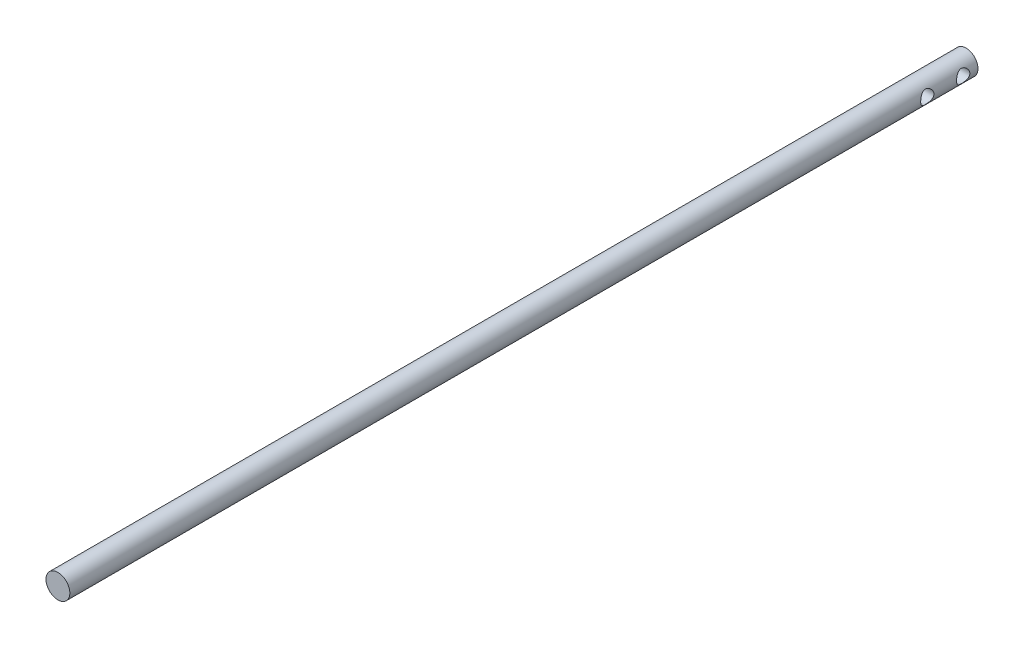
ISO-10303-21;
HEADER;
FILE_DESCRIPTION(('STEP AP214'),'2;1');
FILE_NAME('part.step','',(''),(''),'','','');
FILE_SCHEMA(('AUTOMOTIVE_DESIGN { 1 0 10303 214 1 1 1 1 }'));
ENDSEC;
DATA;
#1=APPLICATION_CONTEXT('core data for automotive mechanical design processes');
#2=APPLICATION_PROTOCOL_DEFINITION('international standard','automotive_design',2000,#1);
#3=PRODUCT_CONTEXT('',#1,'mechanical');
#4=PRODUCT('Part','Part','',(#3));
#5=PRODUCT_RELATED_PRODUCT_CATEGORY('part','',(#4));
#6=PRODUCT_DEFINITION_FORMATION('','',#4);
#7=PRODUCT_DEFINITION_CONTEXT('part definition',#1,'design');
#8=PRODUCT_DEFINITION('design','',#6,#7);
#9=PRODUCT_DEFINITION_SHAPE('','',#8);
#10=(LENGTH_UNIT() NAMED_UNIT(*) SI_UNIT(.MILLI.,.METRE.));
#11=(NAMED_UNIT(*) PLANE_ANGLE_UNIT() SI_UNIT($,.RADIAN.));
#12=(NAMED_UNIT(*) SI_UNIT($,.STERADIAN.) SOLID_ANGLE_UNIT());
#13=UNCERTAINTY_MEASURE_WITH_UNIT(LENGTH_MEASURE(1.E-05),#10,'distance_accuracy_value','');
#14=(GEOMETRIC_REPRESENTATION_CONTEXT(3) GLOBAL_UNCERTAINTY_ASSIGNED_CONTEXT((#13)) GLOBAL_UNIT_ASSIGNED_CONTEXT((#10,
#11,#12)) REPRESENTATION_CONTEXT('',''));
#15=CARTESIAN_POINT('',(0.,0.,0.));
#16=DIRECTION('',(0.,0.,1.));
#17=DIRECTION('',(1.,0.,0.));
#18=AXIS2_PLACEMENT_3D('',#15,#16,#17);
#19=CARTESIAN_POINT('',(0.,0.,290.195));
#20=DIRECTION('',(0.,0.,-1.));
#21=DIRECTION('',(-1.,0.,0.));
#22=AXIS2_PLACEMENT_3D('',#19,#20,#21);
#23=CYLINDRICAL_SURFACE('',#22,3.81);
#24=CARTESIAN_POINT('',(-3.81,0.,6.84315183541359));
#25=CARTESIAN_POINT('',(-3.81000272396915,-0.109903120525368,6.84315500711249));
#26=CARTESIAN_POINT('',(-3.80520404882976,-0.219787942676973,6.83455841836838));
#27=CARTESIAN_POINT('',(-3.78651227067397,-0.436141418658434,6.80064304515037));
#28=CARTESIAN_POINT('',(-3.77261750997984,-0.542609446098237,6.77532121264745));
#29=CARTESIAN_POINT('',(-3.73715283517132,-0.748804273393741,6.70928766939708));
#30=CARTESIAN_POINT('',(-3.71561113855085,-0.848554274168189,6.66863250524741));
#31=CARTESIAN_POINT('',(-3.66674285047561,-1.03963257780774,6.57346806610561));
#32=CARTESIAN_POINT('',(-3.63941486765178,-1.13095884750804,6.51895545832224));
#33=CARTESIAN_POINT('',(-3.57914017104166,-1.30971798893372,6.39336898888395));
#34=CARTESIAN_POINT('',(-3.54593481697913,-1.39643786779143,6.32140674076104));
#35=CARTESIAN_POINT('',(-3.47831320922967,-1.55726145934615,6.16491472285928));
#36=CARTESIAN_POINT('',(-3.44389576026551,-1.63135227256024,6.08037226658719));
#37=CARTESIAN_POINT('',(-3.37364781242873,-1.77240394345993,5.89093911618472));
#38=CARTESIAN_POINT('',(-3.33802821920248,-1.83787879099761,5.78485419480275));
#39=CARTESIAN_POINT('',(-3.27393835112561,-1.94977193066849,5.56112630399932));
#40=CARTESIAN_POINT('',(-3.24545785557034,-1.99621752725982,5.44350019738205));
#41=CARTESIAN_POINT('',(-3.20512079050007,-2.06019863168794,5.22540350678885));
#42=CARTESIAN_POINT('',(-3.1910277368409,-2.08175993194983,5.1265276311545));
#43=CARTESIAN_POINT('',(-3.17208005900489,-2.11052573938803,4.92587638964892));
#44=CARTESIAN_POINT('',(-3.16721631696437,-2.11774441632653,4.82410398635276));
#45=CARTESIAN_POINT('',(-3.16742160305382,-2.11743709347913,4.62048415379751));
#46=CARTESIAN_POINT('',(-3.17250154615915,-2.10989489098596,4.51863676490089));
#47=CARTESIAN_POINT('',(-3.19187418811177,-2.080465654009,4.31792072610913));
#48=CARTESIAN_POINT('',(-3.20617288258727,-2.05856928380448,4.21905405862976));
#49=CARTESIAN_POINT('',(-3.24212105571317,-2.00146831216549,4.02670015829644));
#50=CARTESIAN_POINT('',(-3.26377174327498,-1.96626152194867,3.93321381310434));
#51=CARTESIAN_POINT('',(-3.31208480372718,-1.883739864604,3.75316697359591));
#52=CARTESIAN_POINT('',(-3.33874913247099,-1.83642026958142,3.66660920101127));
#53=CARTESIAN_POINT('',(-3.39899906711665,-1.72268486776781,3.48890391131114));
#54=CARTESIAN_POINT('',(-3.43302054381118,-1.65445926989256,3.39906060995409));
#55=CARTESIAN_POINT('',(-3.50126729124268,-1.50466279846556,3.23128485222354));
#56=CARTESIAN_POINT('',(-3.53549270224972,-1.42308138008866,3.15336190213271));
#57=CARTESIAN_POINT('',(-3.60441371214196,-1.23891483013794,3.00371358012584));
#58=CARTESIAN_POINT('',(-3.63880402550585,-1.13503801247993,2.93342144034924));
#59=CARTESIAN_POINT('',(-3.70030112136082,-0.914824345445167,2.81163722020098));
#60=CARTESIAN_POINT('',(-3.72741269287397,-0.798495759494378,2.76013277049353));
#61=CARTESIAN_POINT('',(-3.7695667060163,-0.565240370458132,2.68135702261876));
#62=CARTESIAN_POINT('',(-3.7853284842378,-0.448940576421957,2.6526266617576));
#63=CARTESIAN_POINT('',(-3.80593181154398,-0.212245630811981,2.61523361721488));
#64=CARTESIAN_POINT('',(-3.81078302180238,-0.0918541983183382,2.60655317938896));
#65=CARTESIAN_POINT('',(-3.80910728244967,0.134855465159482,2.60957441427176));
#66=CARTESIAN_POINT('',(-3.80380890697931,0.241220546506519,2.61907517252856));
#67=CARTESIAN_POINT('',(-3.7847239414742,0.450566421095569,2.65373658120623));
#68=CARTESIAN_POINT('',(-3.77093707741477,0.553547104969691,2.67889773717503));
#69=CARTESIAN_POINT('',(-3.73619799187843,0.753098633615499,2.74363626536289));
#70=CARTESIAN_POINT('',(-3.71527289123877,0.849692111217417,2.78315910867672));
#71=CARTESIAN_POINT('',(-3.66797809494558,1.03498422239975,2.87522811409257));
#72=CARTESIAN_POINT('',(-3.64160694490076,1.12368073798806,2.92777775581076));
#73=CARTESIAN_POINT('',(-3.58251022434211,1.30049216482004,3.05054472705072));
#74=CARTESIAN_POINT('',(-3.54940980724022,1.38760387316841,3.12202516866303));
#75=CARTESIAN_POINT('',(-3.4818910696091,1.54926657528057,3.27760100930728));
#76=CARTESIAN_POINT('',(-3.44747133108784,1.62380356131398,3.36171028185668));
#77=CARTESIAN_POINT('',(-3.37711445462438,1.76581080273581,3.55022424808963));
#78=CARTESIAN_POINT('',(-3.34137455695297,1.83180948334845,3.65582040335671));
#79=CARTESIAN_POINT('',(-3.27687424809242,1.94485341864586,3.87862709172973));
#80=CARTESIAN_POINT('',(-3.24810399517817,1.99192546208335,3.99582091443648));
#81=CARTESIAN_POINT('',(-3.20705719012402,2.05719447009945,4.21347081896027));
#82=CARTESIAN_POINT('',(-3.19259239985026,2.07936557979403,4.3123219752088));
#83=CARTESIAN_POINT('',(-3.17287377744901,2.10933831479679,4.51304379988107));
#84=CARTESIAN_POINT('',(-3.16761072560228,2.11715432365359,4.61491134180289));
#85=CARTESIAN_POINT('',(-3.1670475757208,2.11799670148983,4.81886086876427));
#86=CARTESIAN_POINT('',(-3.17175998818663,2.11100449908454,4.92094296249137));
#87=CARTESIAN_POINT('',(-3.19048127256239,2.08259611667813,5.12222055351287));
#88=CARTESIAN_POINT('',(-3.20449608149149,2.06117072492888,5.22141416507513));
#89=CARTESIAN_POINT('',(-3.23992016074254,2.00501906411773,5.41414615320846));
#90=CARTESIAN_POINT('',(-3.26130554751647,1.97033571687885,5.50770166293879));
#91=CARTESIAN_POINT('',(-3.30916017332902,1.88885852724219,5.68795690476995));
#92=CARTESIAN_POINT('',(-3.33563136858112,1.84206002243654,5.77465398065784));
#93=CARTESIAN_POINT('',(-3.39551449934804,1.72951563045821,5.95261563242561));
#94=CARTESIAN_POINT('',(-3.42937116826468,1.66197689943889,6.04259830370375));
#95=CARTESIAN_POINT('',(-3.49740415879534,1.51358345926981,6.21077175209854));
#96=CARTESIAN_POINT('',(-3.53158071751542,1.43271798849977,6.28895290067345));
#97=CARTESIAN_POINT('',(-3.60063145229145,1.24982573931889,6.4394954710855));
#98=CARTESIAN_POINT('',(-3.63520587096543,1.1464710451529,6.51039689314144));
#99=CARTESIAN_POINT('',(-3.69720244630307,0.927218497318849,6.63349923940364));
#100=CARTESIAN_POINT('',(-3.72462976617008,0.811329784594425,6.68571367369368));
#101=CARTESIAN_POINT('',(-3.76710209126095,0.580960502009219,6.76521115670946));
#102=CARTESIAN_POINT('',(-3.78303047163929,0.467268983213558,6.79429659152459));
#103=CARTESIAN_POINT('',(-3.80447385748752,0.235709049864897,6.8332576519851));
#104=CARTESIAN_POINT('',(-3.80999707921453,0.117844005860025,6.84314843454833));
#105=CARTESIAN_POINT('',(-3.81,0.,6.84315183541359));
#106=B_SPLINE_CURVE_WITH_KNOTS('',3,(#24,#25,#26,#27,#28,#29,#30,#31,#32,#33,#34,#35,#36,#37,
#38,#39,#40,#41,#42,#43,#44,#45,#46,#47,#48,#49,#50,#51,#52,#53,#54,#55,#56,#57,#58,#59,#60,#61,
#62,#63,#64,#65,#66,#67,#68,#69,#70,#71,#72,#73,#74,#75,#76,#77,#78,#79,#80,#81,#82,#83,#84,#85,
#86,#87,#88,#89,#90,#91,#92,#93,#94,#95,#96,#97,#98,#99,#100,#101,#102,#103,#104,#105),
.UNSPECIFIED.,.T.,.F.,(4,2,2,2,2,2,2,2,2,2,2,2,2,2,2,2,2,2,2,2,2,2,2,2,2,2,2,2,2,2,2,2,2,2,2,2,
2,2,2,2,4),(0.,0.329252353923495,0.658564727763082,0.986674346194904,1.31486295157328,
1.66588584058149,2.01726514770462,2.40429388180584,2.79076531941145,3.09595736564765,
3.40084774787264,3.70607298957702,4.01149694210103,4.3169711407877,4.62256475508293,
4.97463709044433,5.32698875016404,5.71512644433624,6.10300813536005,6.46339278710151,
6.82345819681447,7.14266853264614,7.46188917373932,7.77991023995402,8.0980163451661,
8.44892643956651,8.8002248887667,9.18696450104882,9.57315477887972,9.87882359793871,
10.1841859749885,10.489931542155,10.7958724315636,11.1008311314803,11.4059073668881,
11.7569768910705,12.1083313129693,12.4963718301194,12.8841312371766,13.2374523378485,
13.5904943273726),.UNSPECIFIED.);
#107=CARTESIAN_POINT('',(-3.81,0.,6.84315183541359));
#108=VERTEX_POINT('',#107);
#109=EDGE_CURVE('E37',#108,#108,#106,.T.);
#110=ORIENTED_EDGE('',*,*,#109,.T.);
#111=EDGE_LOOP('',(#110));
#112=FACE_BOUND('',#111,.T.);
#113=CARTESIAN_POINT('',(3.81,0.,2.60796529517492));
#114=CARTESIAN_POINT('',(3.81000272396915,-0.109903120525365,2.60796212347602));
#115=CARTESIAN_POINT('',(3.80520404882976,-0.219787942676968,2.61655871222017));
#116=CARTESIAN_POINT('',(3.78651227067397,-0.43614141865843,2.65047408543822));
#117=CARTESIAN_POINT('',(3.77261750997984,-0.542609446098237,2.67579591794113));
#118=CARTESIAN_POINT('',(3.73715283517132,-0.748804273393745,2.7418294611915));
#119=CARTESIAN_POINT('',(3.71561113855085,-0.848554274168194,2.78248462534117));
#120=CARTESIAN_POINT('',(3.66674285047561,-1.03963257780775,2.87764906448297));
#121=CARTESIAN_POINT('',(3.63941486765178,-1.13095884750804,2.93216167226634));
#122=CARTESIAN_POINT('',(3.57914017104166,-1.30971798893372,3.05774814170463));
#123=CARTESIAN_POINT('',(3.54593481697913,-1.39643786779143,3.12971038982754));
#124=CARTESIAN_POINT('',(3.47831320922967,-1.55726145934615,3.2862024077293));
#125=CARTESIAN_POINT('',(3.4438957602655,-1.63135227256025,3.37074486400139));
#126=CARTESIAN_POINT('',(3.37364781242873,-1.77240394345993,3.56017801440386));
#127=CARTESIAN_POINT('',(3.33802821920248,-1.83787879099762,3.66626293578584));
#128=CARTESIAN_POINT('',(3.27393835112561,-1.94977193066849,3.88999082658926));
#129=CARTESIAN_POINT('',(3.24545785557034,-1.99621752725982,4.00761693320653));
#130=CARTESIAN_POINT('',(3.20512079050007,-2.06019863168794,4.22571362379974));
#131=CARTESIAN_POINT('',(3.1910277368409,-2.08175993194983,4.32458949943409));
#132=CARTESIAN_POINT('',(3.17208005900489,-2.11052573938803,4.52524074093966));
#133=CARTESIAN_POINT('',(3.16721631696437,-2.11774441632653,4.62701314423583));
#134=CARTESIAN_POINT('',(3.16742160305382,-2.11743709347913,4.83063297679108));
#135=CARTESIAN_POINT('',(3.17250154615915,-2.10989489098596,4.93248036568769));
#136=CARTESIAN_POINT('',(3.19187418811177,-2.080465654009,5.13319640447945));
#137=CARTESIAN_POINT('',(3.20617288258727,-2.05856928380448,5.23206307195882));
#138=CARTESIAN_POINT('',(3.24212105571317,-2.00146831216549,5.42441697229214));
#139=CARTESIAN_POINT('',(3.26377174327498,-1.96626152194867,5.51790331748424));
#140=CARTESIAN_POINT('',(3.31208480372718,-1.883739864604,5.69795015699267));
#141=CARTESIAN_POINT('',(3.33874913247099,-1.83642026958141,5.7845079295773));
#142=CARTESIAN_POINT('',(3.39899906711665,-1.72268486776781,5.96221321927744));
#143=CARTESIAN_POINT('',(3.43302054381117,-1.65445926989256,6.05205652063449));
#144=CARTESIAN_POINT('',(3.50126729124268,-1.50466279846556,6.21983227836503));
#145=CARTESIAN_POINT('',(3.53549270224972,-1.42308138008866,6.29775522845586));
#146=CARTESIAN_POINT('',(3.60441371214196,-1.23891483013794,6.44740355046273));
#147=CARTESIAN_POINT('',(3.63880402550585,-1.13503801247993,6.51769569023934));
#148=CARTESIAN_POINT('',(3.70030112136082,-0.914824345445169,6.6394799103876));
#149=CARTESIAN_POINT('',(3.72741269287397,-0.798495759494379,6.69098436009504));
#150=CARTESIAN_POINT('',(3.7695667060163,-0.565240370458133,6.76976010796981));
#151=CARTESIAN_POINT('',(3.7853284842378,-0.448940576421958,6.79849046883097));
#152=CARTESIAN_POINT('',(3.80593181154398,-0.212245630811981,6.8358835133737));
#153=CARTESIAN_POINT('',(3.81078302180238,-0.0918541983183383,6.84456395119962));
#154=CARTESIAN_POINT('',(3.80910728244967,0.134855465159482,6.84154271631682));
#155=CARTESIAN_POINT('',(3.80380890697931,0.24122054650652,6.83204195806002));
#156=CARTESIAN_POINT('',(3.7847239414742,0.45056642109557,6.79738054938234));
#157=CARTESIAN_POINT('',(3.77093707741477,0.553547104969692,6.77221939341354));
#158=CARTESIAN_POINT('',(3.73619799187843,0.7530986336155,6.70748086522568));
#159=CARTESIAN_POINT('',(3.71527289123877,0.849692111217418,6.66795802191186));
#160=CARTESIAN_POINT('',(3.66797809494558,1.03498422239975,6.575889016496));
#161=CARTESIAN_POINT('',(3.64160694490076,1.12368073798806,6.52333937477781));
#162=CARTESIAN_POINT('',(3.58251022434211,1.30049216482004,6.40057240353785));
#163=CARTESIAN_POINT('',(3.54940980724022,1.38760387316842,6.32909196192554));
#164=CARTESIAN_POINT('',(3.4818910696091,1.54926657528057,6.17351612128129));
#165=CARTESIAN_POINT('',(3.44747133108784,1.62380356131398,6.08940684873189));
#166=CARTESIAN_POINT('',(3.37711445462438,1.76581080273581,5.90089288249894));
#167=CARTESIAN_POINT('',(3.34137455695297,1.83180948334846,5.79529672723186));
#168=CARTESIAN_POINT('',(3.27687424809242,1.94485341864586,5.57249003885884));
#169=CARTESIAN_POINT('',(3.24810399517817,1.99192546208335,5.45529621615209));
#170=CARTESIAN_POINT('',(3.20705719012402,2.05719447009945,5.2376463116283));
#171=CARTESIAN_POINT('',(3.19259239985026,2.07936557979404,5.13879515537977));
#172=CARTESIAN_POINT('',(3.17287377744901,2.10933831479679,4.93807333070751));
#173=CARTESIAN_POINT('',(3.16761072560228,2.11715432365359,4.83620578878569));
#174=CARTESIAN_POINT('',(3.1670475757208,2.11799670148983,4.63225626182431));
#175=CARTESIAN_POINT('',(3.17175998818663,2.11100449908454,4.53017416809721));
#176=CARTESIAN_POINT('',(3.19048127256239,2.08259611667813,4.32889657707571));
#177=CARTESIAN_POINT('',(3.20449608149149,2.06117072492888,4.22970296551345));
#178=CARTESIAN_POINT('',(3.23992016074254,2.00501906411773,4.03697097738012));
#179=CARTESIAN_POINT('',(3.26130554751647,1.97033571687886,3.94341546764979));
#180=CARTESIAN_POINT('',(3.30916017332902,1.8888585272422,3.76316022581863));
#181=CARTESIAN_POINT('',(3.33563136858112,1.84206002243654,3.67646314993074));
#182=CARTESIAN_POINT('',(3.39551449934803,1.72951563045821,3.49850149816297));
#183=CARTESIAN_POINT('',(3.42937116826468,1.66197689943889,3.40851882688483));
#184=CARTESIAN_POINT('',(3.49740415879534,1.51358345926982,3.24034537849004));
#185=CARTESIAN_POINT('',(3.53158071751542,1.43271798849977,3.16216422991513));
#186=CARTESIAN_POINT('',(3.60063145229145,1.2498257393189,3.01162165950308));
#187=CARTESIAN_POINT('',(3.63520587096543,1.14647104515291,2.94072023744714));
#188=CARTESIAN_POINT('',(3.69720244630307,0.927218497318856,2.81761789118494));
#189=CARTESIAN_POINT('',(3.72462976617008,0.811329784594431,2.76540345689489));
#190=CARTESIAN_POINT('',(3.76710209126095,0.58096050200922,2.68590597387912));
#191=CARTESIAN_POINT('',(3.78303047163929,0.467268983213555,2.65682053906401));
#192=CARTESIAN_POINT('',(3.80447385748752,0.235709049864891,2.61785947860346));
#193=CARTESIAN_POINT('',(3.80999707921453,0.117844005860022,2.60796869604017));
#194=CARTESIAN_POINT('',(3.81,0.,2.60796529517492));
#195=B_SPLINE_CURVE_WITH_KNOTS('',3,(#113,#114,#115,#116,#117,#118,#119,#120,#121,#122,#123,
#124,#125,#126,#127,#128,#129,#130,#131,#132,#133,#134,#135,#136,#137,#138,#139,#140,#141,#142,
#143,#144,#145,#146,#147,#148,#149,#150,#151,#152,#153,#154,#155,#156,#157,#158,#159,#160,#161,
#162,#163,#164,#165,#166,#167,#168,#169,#170,#171,#172,#173,#174,#175,#176,#177,#178,#179,#180,
#181,#182,#183,#184,#185,#186,#187,#188,#189,#190,#191,#192,#193,#194),.UNSPECIFIED.,.T.,.F.,(4,
2,2,2,2,2,2,2,2,2,2,2,2,2,2,2,2,2,2,2,2,2,2,2,2,2,2,2,2,2,2,2,2,2,2,2,2,2,2,2,4),(0.,
0.329252353923494,0.658564727763089,0.986674346194915,1.31486295157329,1.6658858405815,
2.01726514770463,2.40429388180586,2.79076531941146,3.09595736564766,3.40084774787265,
3.70607298957703,4.01149694210104,4.31697114078771,4.62256475508293,4.97463709044434,
5.32698875016405,5.71512644433624,6.10300813536006,6.46339278710152,6.82345819681448,
7.14266853264615,7.46188917373933,7.77991023995403,8.09801634516612,8.44892643956653,
8.80022488876672,9.18696450104884,9.57315477887973,9.87882359793872,10.1841859749885,
10.489931542155,10.7958724315636,11.1008311314803,11.4059073668881,11.7569768910705,
12.1083313129693,12.4963718301194,12.8841312371766,13.2374523378485,13.5904943273726),.UNSPECIFIED.);
#196=CARTESIAN_POINT('',(3.81,0.,2.60796529517492));
#197=VERTEX_POINT('',#196);
#198=EDGE_CURVE('E89',#197,#197,#195,.T.);
#199=ORIENTED_EDGE('',*,*,#198,.T.);
#200=EDGE_LOOP('',(#199));
#201=FACE_BOUND('',#200,.T.);
#202=CARTESIAN_POINT('',(-3.81,0.,18.3060079561915));
#203=CARTESIAN_POINT('',(-3.81000272396915,-0.109903120525367,18.3060111278904));
#204=CARTESIAN_POINT('',(-3.80520404882976,-0.219787942676972,18.2974145391463));
#205=CARTESIAN_POINT('',(-3.78651227067397,-0.436141418658433,18.2634991659283));
#206=CARTESIAN_POINT('',(-3.77261750997984,-0.542609446098237,18.2381773334253));
#207=CARTESIAN_POINT('',(-3.73715283517132,-0.748804273393741,18.172143790175));
#208=CARTESIAN_POINT('',(-3.71561113855085,-0.848554274168189,18.1314886260253));
#209=CARTESIAN_POINT('',(-3.66674285047561,-1.03963257780774,18.0363241868835));
#210=CARTESIAN_POINT('',(-3.63941486765178,-1.13095884750804,17.9818115791001));
#211=CARTESIAN_POINT('',(-3.57914017104166,-1.30971798893372,17.8562251096618));
#212=CARTESIAN_POINT('',(-3.54593481697913,-1.39643786779142,17.7842628615389));
#213=CARTESIAN_POINT('',(-3.47831320922967,-1.55726145934615,17.6277708436372));
#214=CARTESIAN_POINT('',(-3.44389576026551,-1.63135227256024,17.5432283873651));
#215=CARTESIAN_POINT('',(-3.37364781242873,-1.77240394345992,17.3537952369626));
#216=CARTESIAN_POINT('',(-3.33802821920248,-1.83787879099761,17.2477103155806));
#217=CARTESIAN_POINT('',(-3.27393835112561,-1.94977193066849,17.0239824247772));
#218=CARTESIAN_POINT('',(-3.24545785557034,-1.99621752725982,16.9063563181599));
#219=CARTESIAN_POINT('',(-3.20512079050007,-2.06019863168794,16.6882596275667));
#220=CARTESIAN_POINT('',(-3.1910277368409,-2.08175993194982,16.5893837519324));
#221=CARTESIAN_POINT('',(-3.17208005900489,-2.11052573938803,16.3887325104268));
#222=CARTESIAN_POINT('',(-3.16721631696437,-2.11774441632653,16.2869601071307));
#223=CARTESIAN_POINT('',(-3.16742160305382,-2.11743709347913,16.0833402745754));
#224=CARTESIAN_POINT('',(-3.17250154615914,-2.10989489098596,15.9814928856788));
#225=CARTESIAN_POINT('',(-3.19187418811176,-2.080465654009,15.780776846887));
#226=CARTESIAN_POINT('',(-3.20617288258727,-2.05856928380449,15.6819101794077));
#227=CARTESIAN_POINT('',(-3.24212105571317,-2.00146831216549,15.4895562790743));
#228=CARTESIAN_POINT('',(-3.26377174327498,-1.96626152194867,15.3960699338822));
#229=CARTESIAN_POINT('',(-3.31208480372718,-1.883739864604,15.2160230943738));
#230=CARTESIAN_POINT('',(-3.33874913247099,-1.83642026958142,15.1294653217892));
#231=CARTESIAN_POINT('',(-3.39899906711665,-1.72268486776781,14.951760032089));
#232=CARTESIAN_POINT('',(-3.43302054381117,-1.65445926989256,14.861916730732));
#233=CARTESIAN_POINT('',(-3.50126729124268,-1.50466279846557,14.6941409730014));
#234=CARTESIAN_POINT('',(-3.53549270224971,-1.42308138008867,14.6162180229106));
#235=CARTESIAN_POINT('',(-3.60441371214196,-1.23891483013795,14.4665697009037));
#236=CARTESIAN_POINT('',(-3.63880402550584,-1.13503801247994,14.3962775611271));
#237=CARTESIAN_POINT('',(-3.70030112136082,-0.914824345445176,14.2744933409789));
#238=CARTESIAN_POINT('',(-3.72741269287396,-0.798495759494387,14.2229888912714));
#239=CARTESIAN_POINT('',(-3.7695667060163,-0.565240370458141,14.1442131433967));
#240=CARTESIAN_POINT('',(-3.7853284842378,-0.448940576421965,14.1154827825355));
#241=CARTESIAN_POINT('',(-3.80593181154398,-0.212245630811989,14.0780897379928));
#242=CARTESIAN_POINT('',(-3.81078302180238,-0.0918541983183462,14.0694093001669));
#243=CARTESIAN_POINT('',(-3.80910728244967,0.134855465159474,14.0724305350497));
#244=CARTESIAN_POINT('',(-3.80380890697931,0.241220546506511,14.0819312933065));
#245=CARTESIAN_POINT('',(-3.7847239414742,0.450566421095561,14.1165927019841));
#246=CARTESIAN_POINT('',(-3.77093707741478,0.553547104969683,14.1417538579529));
#247=CARTESIAN_POINT('',(-3.73619799187843,0.753098633615491,14.2064923861408));
#248=CARTESIAN_POINT('',(-3.71527289123877,0.849692111217409,14.2460152294546));
#249=CARTESIAN_POINT('',(-3.66797809494559,1.03498422239974,14.3380842348705));
#250=CARTESIAN_POINT('',(-3.64160694490076,1.12368073798805,14.3906338765887));
#251=CARTESIAN_POINT('',(-3.58251022434211,1.30049216482003,14.5134008478286));
#252=CARTESIAN_POINT('',(-3.54940980724022,1.38760387316841,14.5848812894409));
#253=CARTESIAN_POINT('',(-3.48189106960911,1.54926657528056,14.7404571300852));
#254=CARTESIAN_POINT('',(-3.44747133108784,1.62380356131397,14.8245664026346));
#255=CARTESIAN_POINT('',(-3.37711445462439,1.7658108027358,15.0130803688675));
#256=CARTESIAN_POINT('',(-3.34137455695297,1.83180948334845,15.1186765241346));
#257=CARTESIAN_POINT('',(-3.27687424809243,1.94485341864586,15.3414832125076));
#258=CARTESIAN_POINT('',(-3.24810399517817,1.99192546208335,15.4586770352144));
#259=CARTESIAN_POINT('',(-3.20705719012402,2.05719447009945,15.6763269397382));
#260=CARTESIAN_POINT('',(-3.19259239985027,2.07936557979403,15.7751780959867));
#261=CARTESIAN_POINT('',(-3.17287377744901,2.10933831479679,15.975899920659));
#262=CARTESIAN_POINT('',(-3.16761072560228,2.11715432365358,16.0777674625808));
#263=CARTESIAN_POINT('',(-3.1670475757208,2.11799670148983,16.2817169895422));
#264=CARTESIAN_POINT('',(-3.17175998818663,2.11100449908454,16.3837990832693));
#265=CARTESIAN_POINT('',(-3.19048127256239,2.08259611667813,16.5850766742908));
#266=CARTESIAN_POINT('',(-3.20449608149149,2.06117072492888,16.684270285853));
#267=CARTESIAN_POINT('',(-3.23992016074254,2.00501906411773,16.8770022739863));
#268=CARTESIAN_POINT('',(-3.26130554751647,1.97033571687886,16.9705577837167));
#269=CARTESIAN_POINT('',(-3.30916017332902,1.8888585272422,17.1508130255478));
#270=CARTESIAN_POINT('',(-3.33563136858112,1.84206002243654,17.2375101014357));
#271=CARTESIAN_POINT('',(-3.39551449934803,1.72951563045821,17.4154717532035));
#272=CARTESIAN_POINT('',(-3.42937116826468,1.66197689943889,17.5054544244816));
#273=CARTESIAN_POINT('',(-3.49740415879534,1.51358345926982,17.6736278728764));
#274=CARTESIAN_POINT('',(-3.53158071751542,1.43271798849977,17.7518090214513));
#275=CARTESIAN_POINT('',(-3.60063145229145,1.2498257393189,17.9023515918634));
#276=CARTESIAN_POINT('',(-3.63520587096543,1.14647104515291,17.9732530139193));
#277=CARTESIAN_POINT('',(-3.69720244630307,0.927218497318855,18.0963553601815));
#278=CARTESIAN_POINT('',(-3.72462976617008,0.811329784594431,18.1485697944716));
#279=CARTESIAN_POINT('',(-3.76710209126095,0.580960502009224,18.2280672774873));
#280=CARTESIAN_POINT('',(-3.78303047163929,0.467268983213561,18.2571527123025));
#281=CARTESIAN_POINT('',(-3.80447385748752,0.235709049864898,18.296113772763));
#282=CARTESIAN_POINT('',(-3.80999707921453,0.117844005860026,18.3060045553262));
#283=CARTESIAN_POINT('',(-3.81,0.,18.3060079561915));
#284=B_SPLINE_CURVE_WITH_KNOTS('',3,(#202,#203,#204,#205,#206,#207,#208,#209,#210,#211,#212,
#213,#214,#215,#216,#217,#218,#219,#220,#221,#222,#223,#224,#225,#226,#227,#228,#229,#230,#231,
#232,#233,#234,#235,#236,#237,#238,#239,#240,#241,#242,#243,#244,#245,#246,#247,#248,#249,#250,
#251,#252,#253,#254,#255,#256,#257,#258,#259,#260,#261,#262,#263,#264,#265,#266,#267,#268,#269,
#270,#271,#272,#273,#274,#275,#276,#277,#278,#279,#280,#281,#282,#283),.UNSPECIFIED.,.T.,.F.,(4,
2,2,2,2,2,2,2,2,2,2,2,2,2,2,2,2,2,2,2,2,2,2,2,2,2,2,2,2,2,2,2,2,2,2,2,2,2,2,2,4),(0.,
0.329252353923494,0.658564727763083,0.986674346194904,1.31486295157328,1.66588584058149,
2.01726514770462,2.40429388180584,2.79076531941145,3.09595736564764,3.40084774787264,
3.70607298957701,4.01149694210103,4.3169711407877,4.62256475508292,4.97463709044432,
5.32698875016403,5.71512644433623,6.10300813536004,6.4633927871015,6.82345819681447,
7.14266853264613,7.46188917373931,7.77991023995401,8.0980163451661,8.44892643956651,
8.80022488876669,9.18696450104881,9.57315477887971,9.8788235979387,10.1841859749885,
10.489931542155,10.7958724315636,11.1008311314803,11.4059073668881,11.7569768910705,
12.1083313129693,12.4963718301194,12.8841312371766,13.2374523378485,13.5904943273726),.UNSPECIFIED.);
#285=CARTESIAN_POINT('',(-3.81,0.,18.3060079561915));
#286=VERTEX_POINT('',#285);
#287=EDGE_CURVE('E59',#286,#286,#284,.T.);
#288=ORIENTED_EDGE('',*,*,#287,.T.);
#289=EDGE_LOOP('',(#288));
#290=FACE_BOUND('',#289,.T.);
#291=CARTESIAN_POINT('',(3.81,0.,14.0708214159528));
#292=CARTESIAN_POINT('',(3.81000272396915,-0.109903120525365,14.0708182442539));
#293=CARTESIAN_POINT('',(3.80520404882976,-0.219787942676968,14.0794148329981));
#294=CARTESIAN_POINT('',(3.78651227067397,-0.43614141865843,14.1133302062161));
#295=CARTESIAN_POINT('',(3.77261750997984,-0.542609446098237,14.138652038719));
#296=CARTESIAN_POINT('',(3.73715283517132,-0.748804273393745,14.2046855819694));
#297=CARTESIAN_POINT('',(3.71561113855085,-0.848554274168195,14.2453407461191));
#298=CARTESIAN_POINT('',(3.66674285047561,-1.03963257780775,14.3405051852609));
#299=CARTESIAN_POINT('',(3.63941486765178,-1.13095884750804,14.3950177930442));
#300=CARTESIAN_POINT('',(3.57914017104166,-1.30971798893372,14.5206042624825));
#301=CARTESIAN_POINT('',(3.54593481697913,-1.39643786779143,14.5925665106054));
#302=CARTESIAN_POINT('',(3.47831320922967,-1.55726145934615,14.7490585285072));
#303=CARTESIAN_POINT('',(3.4438957602655,-1.63135227256025,14.8336009847793));
#304=CARTESIAN_POINT('',(3.37364781242873,-1.77240394345993,15.0230341351818));
#305=CARTESIAN_POINT('',(3.33802821920248,-1.83787879099762,15.1291190565637));
#306=CARTESIAN_POINT('',(3.27393835112561,-1.94977193066849,15.3528469473672));
#307=CARTESIAN_POINT('',(3.24545785557034,-1.99621752725982,15.4704730539844));
#308=CARTESIAN_POINT('',(3.20512079050007,-2.06019863168794,15.6885697445776));
#309=CARTESIAN_POINT('',(3.1910277368409,-2.08175993194983,15.787445620212));
#310=CARTESIAN_POINT('',(3.17208005900489,-2.11052573938803,15.9880968617176));
#311=CARTESIAN_POINT('',(3.16721631696437,-2.11774441632653,16.0898692650137));
#312=CARTESIAN_POINT('',(3.16742160305382,-2.11743709347913,16.293489097569));
#313=CARTESIAN_POINT('',(3.17250154615915,-2.10989489098596,16.3953364864656));
#314=CARTESIAN_POINT('',(3.19187418811177,-2.080465654009,16.5960525252573));
#315=CARTESIAN_POINT('',(3.20617288258727,-2.05856928380448,16.6949191927367));
#316=CARTESIAN_POINT('',(3.24212105571317,-2.00146831216549,16.88727309307));
#317=CARTESIAN_POINT('',(3.26377174327498,-1.96626152194867,16.9807594382621));
#318=CARTESIAN_POINT('',(3.31208480372718,-1.883739864604,17.1608062777706));
#319=CARTESIAN_POINT('',(3.33874913247099,-1.83642026958142,17.2473640503552));
#320=CARTESIAN_POINT('',(3.39899906711665,-1.72268486776781,17.4250693400553));
#321=CARTESIAN_POINT('',(3.43302054381117,-1.65445926989256,17.5149126414124));
#322=CARTESIAN_POINT('',(3.50126729124268,-1.50466279846556,17.6826883991429));
#323=CARTESIAN_POINT('',(3.53549270224971,-1.42308138008867,17.7606113492338));
#324=CARTESIAN_POINT('',(3.60441371214196,-1.23891483013795,17.9102596712406));
#325=CARTESIAN_POINT('',(3.63880402550585,-1.13503801247994,17.9805518110172));
#326=CARTESIAN_POINT('',(3.70030112136082,-0.914824345445172,18.1023360311655));
#327=CARTESIAN_POINT('',(3.72741269287397,-0.798495759494384,18.1538404808729));
#328=CARTESIAN_POINT('',(3.7695667060163,-0.565240370458138,18.2326162287477));
#329=CARTESIAN_POINT('',(3.7853284842378,-0.448940576421963,18.2613465896089));
#330=CARTESIAN_POINT('',(3.80593181154398,-0.212245630811986,18.2987396341516));
#331=CARTESIAN_POINT('',(3.81078302180238,-0.0918541983183434,18.3074200719775));
#332=CARTESIAN_POINT('',(3.80910728244967,0.134855465159477,18.3043988370947));
#333=CARTESIAN_POINT('',(3.80380890697931,0.241220546506515,18.2948980788379));
#334=CARTESIAN_POINT('',(3.7847239414742,0.450566421095565,18.2602366701602));
#335=CARTESIAN_POINT('',(3.77093707741477,0.553547104969688,18.2350755141914));
#336=CARTESIAN_POINT('',(3.73619799187843,0.753098633615496,18.1703369860036));
#337=CARTESIAN_POINT('',(3.71527289123877,0.849692111217414,18.1308141426898));
#338=CARTESIAN_POINT('',(3.66797809494558,1.03498422239974,18.0387451372739));
#339=CARTESIAN_POINT('',(3.64160694490076,1.12368073798806,17.9861954955557));
#340=CARTESIAN_POINT('',(3.58251022434211,1.30049216482003,17.8634285243158));
#341=CARTESIAN_POINT('',(3.54940980724022,1.38760387316841,17.7919480827034));
#342=CARTESIAN_POINT('',(3.48189106960911,1.54926657528057,17.6363722420592));
#343=CARTESIAN_POINT('',(3.44747133108784,1.62380356131398,17.5522629695098));
#344=CARTESIAN_POINT('',(3.37711445462438,1.76581080273581,17.3637490032768));
#345=CARTESIAN_POINT('',(3.34137455695297,1.83180948334845,17.2581528480098));
#346=CARTESIAN_POINT('',(3.27687424809243,1.94485341864586,17.0353461596367));
#347=CARTESIAN_POINT('',(3.24810399517817,1.99192546208335,16.91815233693));
#348=CARTESIAN_POINT('',(3.20705719012402,2.05719447009945,16.7005024324062));
#349=CARTESIAN_POINT('',(3.19259239985026,2.07936557979403,16.6016512761577));
#350=CARTESIAN_POINT('',(3.17287377744901,2.10933831479679,16.4009294514854));
#351=CARTESIAN_POINT('',(3.16761072560228,2.11715432365359,16.2990619095636));
#352=CARTESIAN_POINT('',(3.1670475757208,2.11799670148983,16.0951123826022));
#353=CARTESIAN_POINT('',(3.17175998818663,2.11100449908454,15.9930302888751));
#354=CARTESIAN_POINT('',(3.19048127256239,2.08259611667813,15.7917526978536));
#355=CARTESIAN_POINT('',(3.20449608149149,2.06117072492888,15.6925590862913));
#356=CARTESIAN_POINT('',(3.23992016074254,2.00501906411773,15.499827098158));
#357=CARTESIAN_POINT('',(3.26130554751647,1.97033571687886,15.4062715884277));
#358=CARTESIAN_POINT('',(3.30916017332902,1.8888585272422,15.2260163465965));
#359=CARTESIAN_POINT('',(3.33563136858112,1.84206002243654,15.1393192707086));
#360=CARTESIAN_POINT('',(3.39551449934803,1.72951563045822,14.9613576189409));
#361=CARTESIAN_POINT('',(3.42937116826468,1.6619768994389,14.8713749476627));
#362=CARTESIAN_POINT('',(3.49740415879533,1.51358345926982,14.7032014992679));
#363=CARTESIAN_POINT('',(3.53158071751541,1.43271798849978,14.625020350693));
#364=CARTESIAN_POINT('',(3.60063145229145,1.2498257393189,14.474477780281));
#365=CARTESIAN_POINT('',(3.63520587096543,1.14647104515291,14.403576358225));
#366=CARTESIAN_POINT('',(3.69720244630307,0.92721849731886,14.2804740119628));
#367=CARTESIAN_POINT('',(3.72462976617008,0.811329784594435,14.2282595776728));
#368=CARTESIAN_POINT('',(3.76710209126095,0.580960502009224,14.148762094657));
#369=CARTESIAN_POINT('',(3.78303047163929,0.467268983213558,14.1196766598419));
#370=CARTESIAN_POINT('',(3.80447385748752,0.235709049864893,14.0807155993814));
#371=CARTESIAN_POINT('',(3.80999707921453,0.117844005860024,14.0708248168181));
#372=CARTESIAN_POINT('',(3.81,0.,14.0708214159528));
#373=B_SPLINE_CURVE_WITH_KNOTS('',3,(#291,#292,#293,#294,#295,#296,#297,#298,#299,#300,#301,
#302,#303,#304,#305,#306,#307,#308,#309,#310,#311,#312,#313,#314,#315,#316,#317,#318,#319,#320,
#321,#322,#323,#324,#325,#326,#327,#328,#329,#330,#331,#332,#333,#334,#335,#336,#337,#338,#339,
#340,#341,#342,#343,#344,#345,#346,#347,#348,#349,#350,#351,#352,#353,#354,#355,#356,#357,#358,
#359,#360,#361,#362,#363,#364,#365,#366,#367,#368,#369,#370,#371,#372),.UNSPECIFIED.,.T.,.F.,(4,
2,2,2,2,2,2,2,2,2,2,2,2,2,2,2,2,2,2,2,2,2,2,2,2,2,2,2,2,2,2,2,2,2,2,2,2,2,2,2,4),(0.,
0.329252353923494,0.658564727763089,0.986674346194916,1.31486295157329,1.6658858405815,
2.01726514770463,2.40429388180586,2.79076531941146,3.09595736564765,3.40084774787265,
3.70607298957702,4.01149694210103,4.3169711407877,4.62256475508293,4.97463709044433,
5.32698875016404,5.71512644433624,6.10300813536005,6.46339278710151,6.82345819681447,
7.14266853264614,7.46188917373932,7.77991023995402,8.09801634516611,8.44892643956651,
8.80022488876671,9.18696450104883,9.57315477887972,9.87882359793871,10.1841859749885,
10.489931542155,10.7958724315636,11.1008311314803,11.4059073668881,11.7569768910705,
12.1083313129693,12.4963718301194,12.8841312371766,13.2374523378485,13.5904943273726),.UNSPECIFIED.);
#374=CARTESIAN_POINT('',(3.81,0.,14.0708214159528));
#375=VERTEX_POINT('',#374);
#376=EDGE_CURVE('E52',#375,#375,#373,.T.);
#377=ORIENTED_EDGE('',*,*,#376,.T.);
#378=EDGE_LOOP('',(#377));
#379=FACE_BOUND('',#378,.T.);
#380=CARTESIAN_POINT('',(0.,0.,290.195));
#381=DIRECTION('',(0.,0.,1.));
#382=DIRECTION('',(1.,0.,0.));
#383=AXIS2_PLACEMENT_3D('',#380,#381,#382);
#384=CIRCLE('',#383,3.81);
#385=CARTESIAN_POINT('',(3.81,0.,290.195));
#386=VERTEX_POINT('',#385);
#387=EDGE_CURVE('E10',#386,#386,#384,.T.);
#388=ORIENTED_EDGE('',*,*,#387,.F.);
#389=EDGE_LOOP('',(#388));
#390=FACE_BOUND('',#389,.T.);
#391=CARTESIAN_POINT('',(0.,0.,0.));
#392=DIRECTION('',(0.,0.,1.));
#393=DIRECTION('',(1.,0.,0.));
#394=AXIS2_PLACEMENT_3D('',#391,#392,#393);
#395=CIRCLE('',#394,3.81);
#396=CARTESIAN_POINT('',(3.81,0.,0.));
#397=VERTEX_POINT('',#396);
#398=EDGE_CURVE('E45',#397,#397,#395,.T.);
#399=ORIENTED_EDGE('',*,*,#398,.T.);
#400=EDGE_LOOP('',(#399));
#401=FACE_BOUND('',#400,.T.);
#402=ADVANCED_FACE('F33',(#112,#201,#290,#379,#390,#401),#23,.T.);
#403=CARTESIAN_POINT('',(0.,0.,290.195));
#404=DIRECTION('',(0.,0.,1.));
#405=DIRECTION('',(1.,0.,0.));
#406=AXIS2_PLACEMENT_3D('',#403,#404,#405);
#407=PLANE('',#406);
#408=ORIENTED_EDGE('',*,*,#387,.T.);
#409=EDGE_LOOP('',(#408));
#410=FACE_BOUND('',#409,.T.);
#411=ADVANCED_FACE('F71',(#410),#407,.T.);
#412=CARTESIAN_POINT('',(0.,0.,0.));
#413=DIRECTION('',(0.,0.,1.));
#414=DIRECTION('',(1.,0.,0.));
#415=AXIS2_PLACEMENT_3D('',#412,#413,#414);
#416=PLANE('',#415);
#417=ORIENTED_EDGE('',*,*,#398,.F.);
#418=EDGE_LOOP('',(#417));
#419=FACE_BOUND('',#418,.T.);
#420=ADVANCED_FACE('F68',(#419),#416,.F.);
#421=CARTESIAN_POINT('',(-23.622,0.,16.1884146860722));
#422=DIRECTION('',(1.,0.,0.));
#423=DIRECTION('',(0.,0.,-1.));
#424=AXIS2_PLACEMENT_3D('',#421,#422,#423);
#425=CYLINDRICAL_SURFACE('',#424,2.11759327011937);
#426=ORIENTED_EDGE('',*,*,#376,.F.);
#427=EDGE_LOOP('',(#426));
#428=FACE_BOUND('',#427,.T.);
#429=ORIENTED_EDGE('',*,*,#287,.F.);
#430=EDGE_LOOP('',(#429));
#431=FACE_BOUND('',#430,.T.);
#432=ADVANCED_FACE('F63',(#428,#431),#425,.F.);
#433=CARTESIAN_POINT('',(-23.622,0.,4.72555856529429));
#434=DIRECTION('',(1.,0.,0.));
#435=DIRECTION('',(0.,0.,-1.));
#436=AXIS2_PLACEMENT_3D('',#433,#434,#435);
#437=CYLINDRICAL_SURFACE('',#436,2.11759327011937);
#438=ORIENTED_EDGE('',*,*,#198,.F.);
#439=EDGE_LOOP('',(#438));
#440=FACE_BOUND('',#439,.T.);
#441=ORIENTED_EDGE('',*,*,#109,.F.);
#442=EDGE_LOOP('',(#441));
#443=FACE_BOUND('',#442,.T.);
#444=ADVANCED_FACE('F67',(#440,#443),#437,.F.);
#445=CLOSED_SHELL('',(#402,#411,#420,#432,#444));
#446=MANIFOLD_SOLID_BREP('B2',#445);
#447=ADVANCED_BREP_SHAPE_REPRESENTATION('',(#18,#446),#14);
#448=SHAPE_DEFINITION_REPRESENTATION(#9,#447);
ENDSEC;
END-ISO-10303-21;
